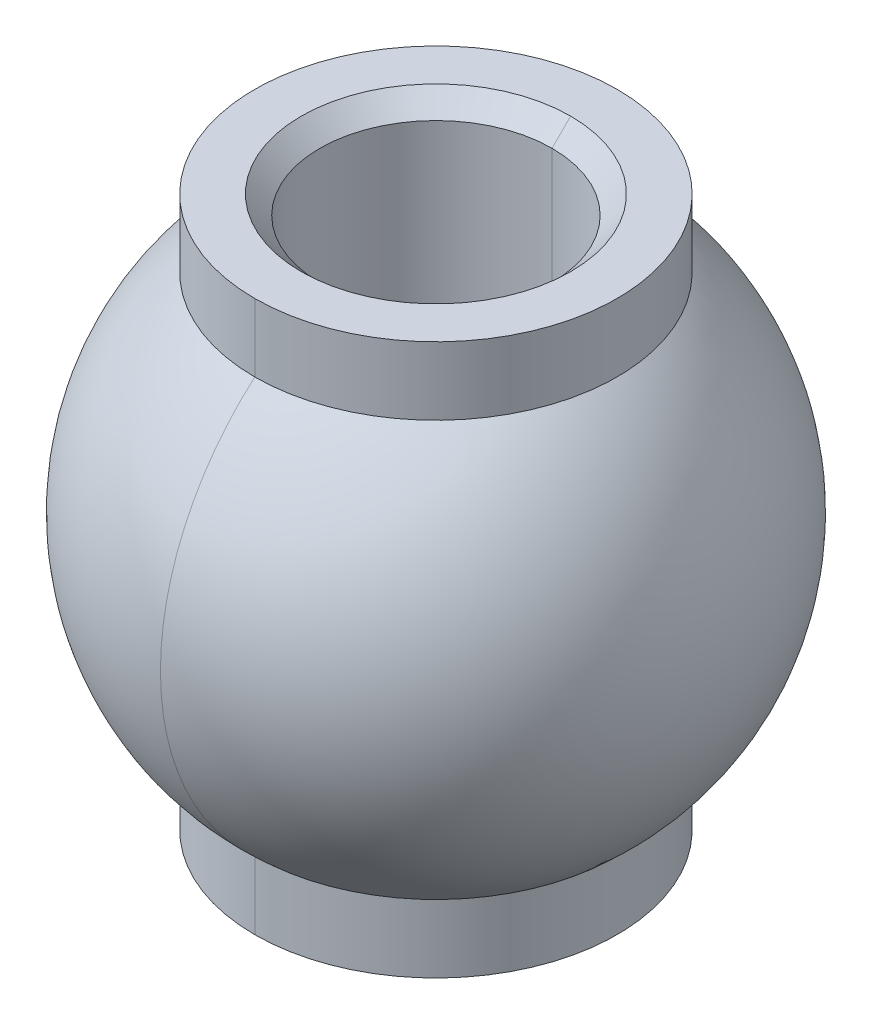
ISO-10303-21;
HEADER;
FILE_DESCRIPTION(('STEP AP214'),'2;1');
FILE_NAME('part.step','',(''),(''),'','','');
FILE_SCHEMA(('AUTOMOTIVE_DESIGN { 1 0 10303 214 1 1 1 1 }'));
ENDSEC;
DATA;
#1=APPLICATION_CONTEXT('core data for automotive mechanical design processes');
#2=APPLICATION_PROTOCOL_DEFINITION('international standard','automotive_design',2000,#1);
#3=PRODUCT_CONTEXT('',#1,'mechanical');
#4=PRODUCT('Part','Part','',(#3));
#5=PRODUCT_RELATED_PRODUCT_CATEGORY('part','',(#4));
#6=PRODUCT_DEFINITION_FORMATION('','',#4);
#7=PRODUCT_DEFINITION_CONTEXT('part definition',#1,'design');
#8=PRODUCT_DEFINITION('design','',#6,#7);
#9=PRODUCT_DEFINITION_SHAPE('','',#8);
#10=(LENGTH_UNIT() NAMED_UNIT(*) SI_UNIT(.MILLI.,.METRE.));
#11=(NAMED_UNIT(*) PLANE_ANGLE_UNIT() SI_UNIT($,.RADIAN.));
#12=(NAMED_UNIT(*) SI_UNIT($,.STERADIAN.) SOLID_ANGLE_UNIT());
#13=UNCERTAINTY_MEASURE_WITH_UNIT(LENGTH_MEASURE(1.E-05),#10,'distance_accuracy_value','');
#14=(GEOMETRIC_REPRESENTATION_CONTEXT(3) GLOBAL_UNCERTAINTY_ASSIGNED_CONTEXT((#13)) GLOBAL_UNIT_ASSIGNED_CONTEXT((#10,
#11,#12)) REPRESENTATION_CONTEXT('',''));
#15=CARTESIAN_POINT('',(0.,0.,0.));
#16=DIRECTION('',(0.,0.,1.));
#17=DIRECTION('',(1.,0.,0.));
#18=AXIS2_PLACEMENT_3D('',#15,#16,#17);
#19=CARTESIAN_POINT('',(0.,0.,0.));
#20=DIRECTION('',(0.,0.,1.));
#21=DIRECTION('',(1.,0.,0.));
#22=AXIS2_PLACEMENT_3D('',#19,#20,#21);
#23=SPHERICAL_SURFACE('',#22,7.5311);
#24=CARTESIAN_POINT('',(0.,0.,0.));
#25=DIRECTION('',(1.,0.,0.));
#26=DIRECTION('',(0.,0.,1.));
#27=AXIS2_PLACEMENT_3D('',#24,#25,#26);
#28=CIRCLE('',#27,7.5311);
#29=CARTESIAN_POINT('',(0.,-5.6732052853744,-4.953));
#30=VERTEX_POINT('',#29);
#31=CARTESIAN_POINT('',(0.,0.,-7.5311));
#32=VERTEX_POINT('',#31);
#33=EDGE_CURVE('E189',#30,#32,#28,.T.);
#34=ORIENTED_EDGE('',*,*,#33,.T.);
#35=CARTESIAN_POINT('',(0.,0.,0.));
#36=DIRECTION('',(1.,0.,0.));
#37=DIRECTION('',(0.,0.,1.));
#38=AXIS2_PLACEMENT_3D('',#35,#36,#37);
#39=CIRCLE('',#38,7.5311);
#40=CARTESIAN_POINT('',(0.,5.6732052853744,-4.953));
#41=VERTEX_POINT('',#40);
#42=EDGE_CURVE('E11',#32,#41,#39,.T.);
#43=ORIENTED_EDGE('',*,*,#42,.T.);
#44=CARTESIAN_POINT('',(0.,5.6732052853744,0.));
#45=DIRECTION('',(0.,-1.,0.));
#46=DIRECTION('',(0.,0.,-1.));
#47=AXIS2_PLACEMENT_3D('',#44,#45,#46);
#48=CIRCLE('',#47,4.953);
#49=CARTESIAN_POINT('',(0.,5.6732052853744,4.953));
#50=VERTEX_POINT('',#49);
#51=EDGE_CURVE('E182',#41,#50,#48,.T.);
#52=ORIENTED_EDGE('',*,*,#51,.T.);
#53=CARTESIAN_POINT('',(0.,0.,0.));
#54=DIRECTION('',(1.,0.,0.));
#55=DIRECTION('',(0.,0.,1.));
#56=AXIS2_PLACEMENT_3D('',#53,#54,#55);
#57=CIRCLE('',#56,7.5311);
#58=CARTESIAN_POINT('',(0.,0.,7.5311));
#59=VERTEX_POINT('',#58);
#60=EDGE_CURVE('E27',#50,#59,#57,.T.);
#61=ORIENTED_EDGE('',*,*,#60,.T.);
#62=CARTESIAN_POINT('',(0.,0.,0.));
#63=DIRECTION('',(1.,0.,0.));
#64=DIRECTION('',(0.,0.,1.));
#65=AXIS2_PLACEMENT_3D('',#62,#63,#64);
#66=CIRCLE('',#65,7.5311);
#67=CARTESIAN_POINT('',(0.,-5.6732052853744,4.953));
#68=VERTEX_POINT('',#67);
#69=EDGE_CURVE('E193',#59,#68,#66,.T.);
#70=ORIENTED_EDGE('',*,*,#69,.T.);
#71=CARTESIAN_POINT('',(0.,-5.6732052853744,0.));
#72=DIRECTION('',(0.,1.,0.));
#73=DIRECTION('',(0.,0.,-1.));
#74=AXIS2_PLACEMENT_3D('',#71,#72,#73);
#75=CIRCLE('',#74,4.953);
#76=EDGE_CURVE('E178',#68,#30,#75,.T.);
#77=ORIENTED_EDGE('',*,*,#76,.T.);
#78=EDGE_LOOP('',(#34,#43,#52,#61,#70,#77));
#79=FACE_BOUND('',#78,.T.);
#80=ADVANCED_FACE('F16',(#79),#23,.T.);
#81=CARTESIAN_POINT('',(0.,0.,0.));
#82=DIRECTION('',(0.,0.,1.));
#83=DIRECTION('',(1.,0.,0.));
#84=AXIS2_PLACEMENT_3D('',#81,#82,#83);
#85=SPHERICAL_SURFACE('',#84,7.5311);
#86=ORIENTED_EDGE('',*,*,#33,.F.);
#87=CARTESIAN_POINT('',(0.,-5.6732052853744,0.));
#88=DIRECTION('',(0.,1.,0.));
#89=DIRECTION('',(0.,0.,-1.));
#90=AXIS2_PLACEMENT_3D('',#87,#88,#89);
#91=CIRCLE('',#90,4.953);
#92=EDGE_CURVE('E177',#30,#68,#91,.T.);
#93=ORIENTED_EDGE('',*,*,#92,.T.);
#94=ORIENTED_EDGE('',*,*,#69,.F.);
#95=ORIENTED_EDGE('',*,*,#60,.F.);
#96=CARTESIAN_POINT('',(0.,5.6732052853744,0.));
#97=DIRECTION('',(0.,-1.,0.));
#98=DIRECTION('',(0.,0.,-1.));
#99=AXIS2_PLACEMENT_3D('',#96,#97,#98);
#100=CIRCLE('',#99,4.953);
#101=EDGE_CURVE('E163',#50,#41,#100,.T.);
#102=ORIENTED_EDGE('',*,*,#101,.T.);
#103=ORIENTED_EDGE('',*,*,#42,.F.);
#104=EDGE_LOOP('',(#86,#93,#94,#95,#102,#103));
#105=FACE_BOUND('',#104,.T.);
#106=ADVANCED_FACE('F301',(#105),#85,.T.);
#107=CARTESIAN_POINT('',(0.,0.,0.));
#108=DIRECTION('',(0.,1.,0.));
#109=DIRECTION('',(0.,0.,-1.));
#110=AXIS2_PLACEMENT_3D('',#107,#108,#109);
#111=CYLINDRICAL_SURFACE('',#110,4.953);
#112=DIRECTION('',(0.,1.,0.));
#113=VECTOR('',#112,1.);
#114=CARTESIAN_POINT('',(0.,0.,-4.953));
#115=LINE('',#114,#113);
#116=CARTESIAN_POINT('',(0.,7.5311,-4.953));
#117=VERTEX_POINT('',#116);
#118=EDGE_CURVE('E197',#41,#117,#115,.T.);
#119=ORIENTED_EDGE('',*,*,#118,.T.);
#120=CARTESIAN_POINT('',(0.,7.5311,0.));
#121=DIRECTION('',(0.,1.,0.));
#122=DIRECTION('',(0.,0.,-1.));
#123=AXIS2_PLACEMENT_3D('',#120,#121,#122);
#124=CIRCLE('',#123,4.953);
#125=CARTESIAN_POINT('',(0.,7.5311,4.953));
#126=VERTEX_POINT('',#125);
#127=EDGE_CURVE('E157',#126,#117,#124,.T.);
#128=ORIENTED_EDGE('',*,*,#127,.F.);
#129=DIRECTION('',(0.,-1.,0.));
#130=VECTOR('',#129,1.);
#131=CARTESIAN_POINT('',(0.,0.,4.953));
#132=LINE('',#131,#130);
#133=EDGE_CURVE('E159',#126,#50,#132,.T.);
#134=ORIENTED_EDGE('',*,*,#133,.T.);
#135=ORIENTED_EDGE('',*,*,#51,.F.);
#136=EDGE_LOOP('',(#119,#128,#134,#135));
#137=FACE_BOUND('',#136,.T.);
#138=ADVANCED_FACE('F306',(#137),#111,.T.);
#139=CARTESIAN_POINT('',(0.,0.,0.));
#140=DIRECTION('',(0.,1.,0.));
#141=DIRECTION('',(0.,0.,-1.));
#142=AXIS2_PLACEMENT_3D('',#139,#140,#141);
#143=CYLINDRICAL_SURFACE('',#142,4.953);
#144=DIRECTION('',(0.,1.,0.));
#145=VECTOR('',#144,1.);
#146=CARTESIAN_POINT('',(0.,0.,-4.953));
#147=LINE('',#146,#145);
#148=CARTESIAN_POINT('',(0.,-7.5311,-4.953));
#149=VERTEX_POINT('',#148);
#150=EDGE_CURVE('E162',#149,#30,#147,.T.);
#151=ORIENTED_EDGE('',*,*,#150,.T.);
#152=ORIENTED_EDGE('',*,*,#76,.F.);
#153=DIRECTION('',(0.,-1.,0.));
#154=VECTOR('',#153,1.);
#155=CARTESIAN_POINT('',(0.,0.,4.953));
#156=LINE('',#155,#154);
#157=CARTESIAN_POINT('',(0.,-7.5311,4.953));
#158=VERTEX_POINT('',#157);
#159=EDGE_CURVE('E174',#68,#158,#156,.T.);
#160=ORIENTED_EDGE('',*,*,#159,.T.);
#161=CARTESIAN_POINT('',(0.,-7.5311,0.));
#162=DIRECTION('',(0.,-1.,0.));
#163=DIRECTION('',(0.,0.,-1.));
#164=AXIS2_PLACEMENT_3D('',#161,#162,#163);
#165=CIRCLE('',#164,4.953);
#166=EDGE_CURVE('E124',#149,#158,#165,.T.);
#167=ORIENTED_EDGE('',*,*,#166,.F.);
#168=EDGE_LOOP('',(#151,#152,#160,#167));
#169=FACE_BOUND('',#168,.T.);
#170=ADVANCED_FACE('F350',(#169),#143,.T.);
#171=CARTESIAN_POINT('',(0.,0.,0.));
#172=DIRECTION('',(0.,1.,0.));
#173=DIRECTION('',(0.,0.,-1.));
#174=AXIS2_PLACEMENT_3D('',#171,#172,#173);
#175=CYLINDRICAL_SURFACE('',#174,4.953);
#176=ORIENTED_EDGE('',*,*,#150,.F.);
#177=CARTESIAN_POINT('',(0.,-7.5311,0.));
#178=DIRECTION('',(0.,-1.,0.));
#179=DIRECTION('',(0.,0.,-1.));
#180=AXIS2_PLACEMENT_3D('',#177,#178,#179);
#181=CIRCLE('',#180,4.953);
#182=EDGE_CURVE('E158',#158,#149,#181,.T.);
#183=ORIENTED_EDGE('',*,*,#182,.F.);
#184=ORIENTED_EDGE('',*,*,#159,.F.);
#185=ORIENTED_EDGE('',*,*,#92,.F.);
#186=EDGE_LOOP('',(#176,#183,#184,#185));
#187=FACE_BOUND('',#186,.T.);
#188=ADVANCED_FACE('F355',(#187),#175,.T.);
#189=CARTESIAN_POINT('',(0.,0.,0.));
#190=DIRECTION('',(0.,1.,0.));
#191=DIRECTION('',(0.,0.,-1.));
#192=AXIS2_PLACEMENT_3D('',#189,#190,#191);
#193=CYLINDRICAL_SURFACE('',#192,4.953);
#194=ORIENTED_EDGE('',*,*,#118,.F.);
#195=ORIENTED_EDGE('',*,*,#101,.F.);
#196=ORIENTED_EDGE('',*,*,#133,.F.);
#197=CARTESIAN_POINT('',(0.,7.5311,0.));
#198=DIRECTION('',(0.,1.,0.));
#199=DIRECTION('',(0.,0.,-1.));
#200=AXIS2_PLACEMENT_3D('',#197,#198,#199);
#201=CIRCLE('',#200,4.953);
#202=EDGE_CURVE('E153',#117,#126,#201,.T.);
#203=ORIENTED_EDGE('',*,*,#202,.F.);
#204=EDGE_LOOP('',(#194,#195,#196,#203));
#205=FACE_BOUND('',#204,.T.);
#206=ADVANCED_FACE('F18',(#205),#193,.T.);
#207=CARTESIAN_POINT('',(0.,7.5311,0.));
#208=DIRECTION('',(0.,1.,0.));
#209=DIRECTION('',(1.,0.,0.));
#210=AXIS2_PLACEMENT_3D('',#207,#208,#209);
#211=PLANE('',#210);
#212=ORIENTED_EDGE('',*,*,#202,.T.);
#213=ORIENTED_EDGE('',*,*,#127,.T.);
#214=EDGE_LOOP('',(#212,#213));
#215=FACE_BOUND('',#214,.T.);
#216=CARTESIAN_POINT('',(0.,7.5311,0.));
#217=DIRECTION('',(0.,-1.,0.));
#218=DIRECTION('',(0.,0.,-1.));
#219=AXIS2_PLACEMENT_3D('',#216,#217,#218);
#220=CIRCLE('',#219,3.683);
#221=CARTESIAN_POINT('',(0.,7.5311,-3.683));
#222=VERTEX_POINT('',#221);
#223=CARTESIAN_POINT('',(0.,7.5311,3.683));
#224=VERTEX_POINT('',#223);
#225=EDGE_CURVE('E116',#222,#224,#220,.T.);
#226=ORIENTED_EDGE('',*,*,#225,.T.);
#227=CARTESIAN_POINT('',(0.,7.5311,0.));
#228=DIRECTION('',(0.,-1.,0.));
#229=DIRECTION('',(0.,0.,-1.));
#230=AXIS2_PLACEMENT_3D('',#227,#228,#229);
#231=CIRCLE('',#230,3.683);
#232=EDGE_CURVE('E120',#224,#222,#231,.T.);
#233=ORIENTED_EDGE('',*,*,#232,.T.);
#234=EDGE_LOOP('',(#226,#233));
#235=FACE_BOUND('',#234,.T.);
#236=ADVANCED_FACE('F118',(#215,#235),#211,.T.);
#237=CARTESIAN_POINT('',(0.,-7.5311,0.));
#238=DIRECTION('',(0.,-1.,0.));
#239=DIRECTION('',(0.,0.,-1.));
#240=AXIS2_PLACEMENT_3D('',#237,#238,#239);
#241=PLANE('',#240);
#242=ORIENTED_EDGE('',*,*,#166,.T.);
#243=ORIENTED_EDGE('',*,*,#182,.T.);
#244=EDGE_LOOP('',(#242,#243));
#245=FACE_BOUND('',#244,.T.);
#246=CARTESIAN_POINT('',(0.,-7.5311,0.));
#247=DIRECTION('',(0.,1.,0.));
#248=DIRECTION('',(0.,0.,-1.));
#249=AXIS2_PLACEMENT_3D('',#246,#247,#248);
#250=CIRCLE('',#249,3.683);
#251=CARTESIAN_POINT('',(0.,-7.5311,-3.683));
#252=VERTEX_POINT('',#251);
#253=CARTESIAN_POINT('',(0.,-7.5311,3.683));
#254=VERTEX_POINT('',#253);
#255=EDGE_CURVE('E70',#252,#254,#250,.T.);
#256=ORIENTED_EDGE('',*,*,#255,.T.);
#257=CARTESIAN_POINT('',(0.,-7.5311,0.));
#258=DIRECTION('',(0.,1.,0.));
#259=DIRECTION('',(0.,0.,-1.));
#260=AXIS2_PLACEMENT_3D('',#257,#258,#259);
#261=CIRCLE('',#260,3.683);
#262=EDGE_CURVE('E148',#254,#252,#261,.T.);
#263=ORIENTED_EDGE('',*,*,#262,.T.);
#264=EDGE_LOOP('',(#256,#263));
#265=FACE_BOUND('',#264,.T.);
#266=ADVANCED_FACE('F274',(#245,#265),#241,.T.);
#267=CARTESIAN_POINT('',(0.,7.2771,0.));
#268=DIRECTION('',(0.,1.,0.));
#269=DIRECTION('',(0.,0.,-1.));
#270=AXIS2_PLACEMENT_3D('',#267,#268,#269);
#271=CONICAL_SURFACE('',#270,3.429,0.785398163397448);
#272=DIRECTION('',(0.,0.707106781186548,-0.707106781186547));
#273=VECTOR('',#272,1.);
#274=CARTESIAN_POINT('',(0.,7.2771,-3.429));
#275=LINE('',#274,#273);
#276=CARTESIAN_POINT('',(0.,7.0231,-3.175));
#277=VERTEX_POINT('',#276);
#278=EDGE_CURVE('E137',#277,#222,#275,.T.);
#279=ORIENTED_EDGE('',*,*,#278,.F.);
#280=CARTESIAN_POINT('',(0.,7.0231,0.));
#281=DIRECTION('',(0.,1.,0.));
#282=DIRECTION('',(0.,0.,-1.));
#283=AXIS2_PLACEMENT_3D('',#280,#281,#282);
#284=CIRCLE('',#283,3.175);
#285=CARTESIAN_POINT('',(0.,7.0231,3.175));
#286=VERTEX_POINT('',#285);
#287=EDGE_CURVE('E130',#286,#277,#284,.T.);
#288=ORIENTED_EDGE('',*,*,#287,.F.);
#289=DIRECTION('',(0.,-0.707106781186548,-0.707106781186547));
#290=VECTOR('',#289,1.);
#291=CARTESIAN_POINT('',(0.,7.2771,3.429));
#292=LINE('',#291,#290);
#293=EDGE_CURVE('E125',#224,#286,#292,.T.);
#294=ORIENTED_EDGE('',*,*,#293,.F.);
#295=ORIENTED_EDGE('',*,*,#225,.F.);
#296=EDGE_LOOP('',(#279,#288,#294,#295));
#297=FACE_BOUND('',#296,.T.);
#298=ADVANCED_FACE('F128',(#297),#271,.F.);
#299=CARTESIAN_POINT('',(0.,7.2771,0.));
#300=DIRECTION('',(0.,1.,0.));
#301=DIRECTION('',(0.,0.,-1.));
#302=AXIS2_PLACEMENT_3D('',#299,#300,#301);
#303=CONICAL_SURFACE('',#302,3.429,0.785398163397448);
#304=ORIENTED_EDGE('',*,*,#278,.T.);
#305=ORIENTED_EDGE('',*,*,#232,.F.);
#306=ORIENTED_EDGE('',*,*,#293,.T.);
#307=CARTESIAN_POINT('',(0.,7.0231,0.));
#308=DIRECTION('',(0.,1.,0.));
#309=DIRECTION('',(0.,0.,-1.));
#310=AXIS2_PLACEMENT_3D('',#307,#308,#309);
#311=CIRCLE('',#310,3.175);
#312=EDGE_CURVE('E165',#277,#286,#311,.T.);
#313=ORIENTED_EDGE('',*,*,#312,.F.);
#314=EDGE_LOOP('',(#304,#305,#306,#313));
#315=FACE_BOUND('',#314,.T.);
#316=ADVANCED_FACE('F136',(#315),#303,.F.);
#317=CARTESIAN_POINT('',(0.,-7.2771,0.));
#318=DIRECTION('',(0.,-1.,0.));
#319=DIRECTION('',(0.,0.,-1.));
#320=AXIS2_PLACEMENT_3D('',#317,#318,#319);
#321=CONICAL_SURFACE('',#320,3.429,0.785398163397448);
#322=DIRECTION('',(0.,-0.707106781186548,-0.707106781186547));
#323=VECTOR('',#322,1.);
#324=CARTESIAN_POINT('',(0.,-7.2771,-3.429));
#325=LINE('',#324,#323);
#326=CARTESIAN_POINT('',(0.,-7.0231,-3.175));
#327=VERTEX_POINT('',#326);
#328=EDGE_CURVE('E150',#327,#252,#325,.T.);
#329=ORIENTED_EDGE('',*,*,#328,.F.);
#330=CARTESIAN_POINT('',(0.,-7.0231,0.));
#331=DIRECTION('',(0.,-1.,0.));
#332=DIRECTION('',(0.,0.,-1.));
#333=AXIS2_PLACEMENT_3D('',#330,#331,#332);
#334=CIRCLE('',#333,3.175);
#335=CARTESIAN_POINT('',(0.,-7.0231,3.175));
#336=VERTEX_POINT('',#335);
#337=EDGE_CURVE('E202',#336,#327,#334,.T.);
#338=ORIENTED_EDGE('',*,*,#337,.F.);
#339=DIRECTION('',(0.,0.707106781186548,-0.707106781186547));
#340=VECTOR('',#339,1.);
#341=CARTESIAN_POINT('',(0.,-7.2771,3.429));
#342=LINE('',#341,#340);
#343=EDGE_CURVE('E205',#254,#336,#342,.T.);
#344=ORIENTED_EDGE('',*,*,#343,.F.);
#345=ORIENTED_EDGE('',*,*,#255,.F.);
#346=EDGE_LOOP('',(#329,#338,#344,#345));
#347=FACE_BOUND('',#346,.T.);
#348=ADVANCED_FACE('F317',(#347),#321,.F.);
#349=CARTESIAN_POINT('',(0.,-7.2771,0.));
#350=DIRECTION('',(0.,-1.,0.));
#351=DIRECTION('',(0.,0.,-1.));
#352=AXIS2_PLACEMENT_3D('',#349,#350,#351);
#353=CONICAL_SURFACE('',#352,3.429,0.785398163397448);
#354=ORIENTED_EDGE('',*,*,#328,.T.);
#355=ORIENTED_EDGE('',*,*,#262,.F.);
#356=ORIENTED_EDGE('',*,*,#343,.T.);
#357=CARTESIAN_POINT('',(0.,-7.0231,0.));
#358=DIRECTION('',(0.,-1.,0.));
#359=DIRECTION('',(0.,0.,-1.));
#360=AXIS2_PLACEMENT_3D('',#357,#358,#359);
#361=CIRCLE('',#360,3.175);
#362=EDGE_CURVE('E20',#327,#336,#361,.T.);
#363=ORIENTED_EDGE('',*,*,#362,.F.);
#364=EDGE_LOOP('',(#354,#355,#356,#363));
#365=FACE_BOUND('',#364,.T.);
#366=ADVANCED_FACE('F261',(#365),#353,.F.);
#367=CARTESIAN_POINT('',(0.,0.,0.));
#368=DIRECTION('',(0.,1.,0.));
#369=DIRECTION('',(0.,0.,-1.));
#370=AXIS2_PLACEMENT_3D('',#367,#368,#369);
#371=CYLINDRICAL_SURFACE('',#370,3.175);
#372=DIRECTION('',(0.,-1.,0.));
#373=VECTOR('',#372,1.);
#374=CARTESIAN_POINT('',(0.,0.,-3.175));
#375=LINE('',#374,#373);
#376=EDGE_CURVE('E169',#277,#327,#375,.T.);
#377=ORIENTED_EDGE('',*,*,#376,.T.);
#378=ORIENTED_EDGE('',*,*,#362,.T.);
#379=DIRECTION('',(0.,1.,0.));
#380=VECTOR('',#379,1.);
#381=CARTESIAN_POINT('',(0.,0.,3.175));
#382=LINE('',#381,#380);
#383=EDGE_CURVE('E168',#336,#286,#382,.T.);
#384=ORIENTED_EDGE('',*,*,#383,.T.);
#385=ORIENTED_EDGE('',*,*,#287,.T.);
#386=EDGE_LOOP('',(#377,#378,#384,#385));
#387=FACE_BOUND('',#386,.T.);
#388=ADVANCED_FACE('F240',(#387),#371,.F.);
#389=CARTESIAN_POINT('',(0.,0.,0.));
#390=DIRECTION('',(0.,1.,0.));
#391=DIRECTION('',(0.,0.,-1.));
#392=AXIS2_PLACEMENT_3D('',#389,#390,#391);
#393=CYLINDRICAL_SURFACE('',#392,3.175);
#394=ORIENTED_EDGE('',*,*,#376,.F.);
#395=ORIENTED_EDGE('',*,*,#312,.T.);
#396=ORIENTED_EDGE('',*,*,#383,.F.);
#397=ORIENTED_EDGE('',*,*,#337,.T.);
#398=EDGE_LOOP('',(#394,#395,#396,#397));
#399=FACE_BOUND('',#398,.T.);
#400=ADVANCED_FACE('F245',(#399),#393,.F.);
#401=CLOSED_SHELL('',(#80,#106,#138,#170,#188,#206,#236,#266,#298,#316,#348,#366,#388,#400));
#402=MANIFOLD_SOLID_BREP('B1',#401);
#403=ADVANCED_BREP_SHAPE_REPRESENTATION('',(#18,#402),#14);
#404=SHAPE_DEFINITION_REPRESENTATION(#9,#403);
ENDSEC;
END-ISO-10303-21;
